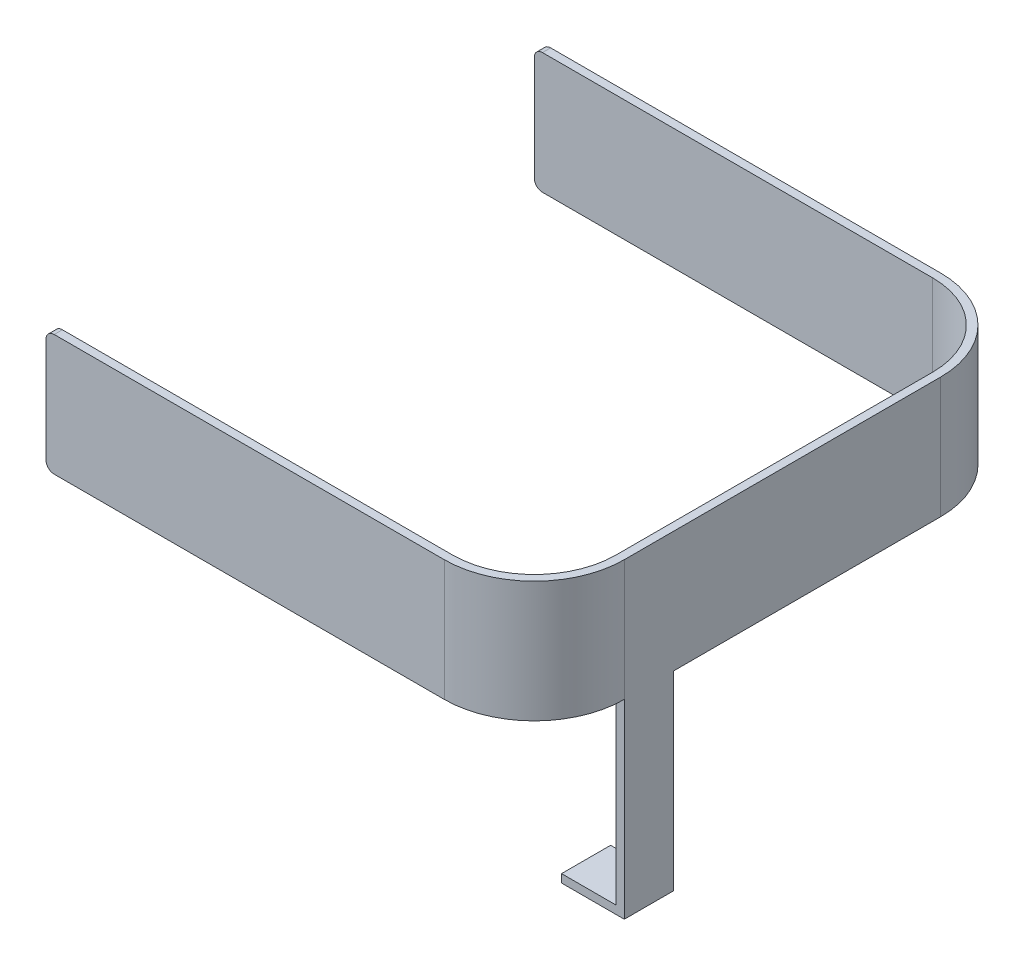
ISO-10303-21;
HEADER;
FILE_DESCRIPTION(('STEP AP214'),'2;1');
FILE_NAME('part.step','',(''),(''),'','','');
FILE_SCHEMA(('AUTOMOTIVE_DESIGN { 1 0 10303 214 1 1 1 1 }'));
ENDSEC;
DATA;
#1=APPLICATION_CONTEXT('core data for automotive mechanical design processes');
#2=APPLICATION_PROTOCOL_DEFINITION('international standard','automotive_design',2000,#1);
#3=PRODUCT_CONTEXT('',#1,'mechanical');
#4=PRODUCT('Part','Part','',(#3));
#5=PRODUCT_RELATED_PRODUCT_CATEGORY('part','',(#4));
#6=PRODUCT_DEFINITION_FORMATION('','',#4);
#7=PRODUCT_DEFINITION_CONTEXT('part definition',#1,'design');
#8=PRODUCT_DEFINITION('design','',#6,#7);
#9=PRODUCT_DEFINITION_SHAPE('','',#8);
#10=(LENGTH_UNIT() NAMED_UNIT(*) SI_UNIT(.MILLI.,.METRE.));
#11=(NAMED_UNIT(*) PLANE_ANGLE_UNIT() SI_UNIT($,.RADIAN.));
#12=(NAMED_UNIT(*) SI_UNIT($,.STERADIAN.) SOLID_ANGLE_UNIT());
#13=UNCERTAINTY_MEASURE_WITH_UNIT(LENGTH_MEASURE(1.E-05),#10,'distance_accuracy_value','');
#14=(GEOMETRIC_REPRESENTATION_CONTEXT(3) GLOBAL_UNCERTAINTY_ASSIGNED_CONTEXT((#13)) GLOBAL_UNIT_ASSIGNED_CONTEXT((#10,
#11,#12)) REPRESENTATION_CONTEXT('',''));
#15=CARTESIAN_POINT('',(0.,0.,0.));
#16=DIRECTION('',(0.,0.,1.));
#17=DIRECTION('',(1.,0.,0.));
#18=AXIS2_PLACEMENT_3D('',#15,#16,#17);
#19=CARTESIAN_POINT('',(0.3,-1.89655172413793,5.5));
#20=DIRECTION('',(0.,0.,-1.));
#21=DIRECTION('',(0.,1.,0.));
#22=AXIS2_PLACEMENT_3D('',#19,#20,#21);
#23=PLANE('',#22);
#24=DIRECTION('',(1.,0.,0.));
#25=VECTOR('',#24,1.);
#26=CARTESIAN_POINT('',(0.,-2.33291536050157,5.5));
#27=LINE('',#26,#25);
#28=CARTESIAN_POINT('',(0.,-2.33291536050157,5.5));
#29=VERTEX_POINT('',#28);
#30=CARTESIAN_POINT('',(0.3,-2.33291536050157,5.5));
#31=VERTEX_POINT('',#30);
#32=EDGE_CURVE('E331',#29,#31,#27,.T.);
#33=ORIENTED_EDGE('',*,*,#32,.F.);
#34=DIRECTION('',(0.,-1.,0.));
#35=VECTOR('',#34,1.);
#36=CARTESIAN_POINT('',(0.,-1.89655172413793,5.5));
#37=LINE('',#36,#35);
#38=CARTESIAN_POINT('',(0.,-9.01291536050157,5.5));
#39=VERTEX_POINT('',#38);
#40=EDGE_CURVE('E248',#29,#39,#37,.T.);
#41=ORIENTED_EDGE('',*,*,#40,.T.);
#42=DIRECTION('',(1.,0.,0.));
#43=VECTOR('',#42,1.);
#44=CARTESIAN_POINT('',(-2.,-9.01291536050157,5.5));
#45=LINE('',#44,#43);
#46=CARTESIAN_POINT('',(-2.,-9.01291536050157,5.5));
#47=VERTEX_POINT('',#46);
#48=EDGE_CURVE('E228',#47,#39,#45,.T.);
#49=ORIENTED_EDGE('',*,*,#48,.F.);
#50=DIRECTION('',(0.,1.,0.));
#51=VECTOR('',#50,1.);
#52=CARTESIAN_POINT('',(-2.,-9.31291536050157,5.5));
#53=LINE('',#52,#51);
#54=CARTESIAN_POINT('',(-2.,-9.31291536050157,5.5));
#55=VERTEX_POINT('',#54);
#56=EDGE_CURVE('E221',#55,#47,#53,.T.);
#57=ORIENTED_EDGE('',*,*,#56,.F.);
#58=DIRECTION('',(-1.,0.,0.));
#59=VECTOR('',#58,1.);
#60=CARTESIAN_POINT('',(0.3,-9.31291536050157,5.5));
#61=LINE('',#60,#59);
#62=CARTESIAN_POINT('',(0.3,-9.31291536050157,5.5));
#63=VERTEX_POINT('',#62);
#64=EDGE_CURVE('E262',#63,#55,#61,.T.);
#65=ORIENTED_EDGE('',*,*,#64,.F.);
#66=DIRECTION('',(0.,-1.,0.));
#67=VECTOR('',#66,1.);
#68=CARTESIAN_POINT('',(0.3,1.39655172413793,5.5));
#69=LINE('',#68,#67);
#70=EDGE_CURVE('E236',#31,#63,#69,.T.);
#71=ORIENTED_EDGE('',*,*,#70,.F.);
#72=EDGE_LOOP('',(#33,#41,#49,#57,#65,#71));
#73=FACE_BOUND('',#72,.T.);
#74=ADVANCED_FACE('F40',(#73),#23,.F.);
#75=CARTESIAN_POINT('',(0.3,2.10344827586207,5.5));
#76=DIRECTION('',(0.,-1.,0.));
#77=DIRECTION('',(0.,0.,-1.));
#78=AXIS2_PLACEMENT_3D('',#75,#76,#77);
#79=PLANE('',#78);
#80=DIRECTION('',(1.,0.,0.));
#81=VECTOR('',#80,1.);
#82=CARTESIAN_POINT('',(-17.6,2.10344827586207,8.50000000000005));
#83=LINE('',#82,#81);
#84=CARTESIAN_POINT('',(-17.3,2.10344827586207,8.50000000000005));
#85=VERTEX_POINT('',#84);
#86=CARTESIAN_POINT('',(-2.99999999999999,2.10344827586207,8.5));
#87=VERTEX_POINT('',#86);
#88=EDGE_CURVE('E323',#85,#87,#83,.T.);
#89=ORIENTED_EDGE('',*,*,#88,.F.);
#90=DIRECTION('',(0.,0.,-1.));
#91=VECTOR('',#90,1.);
#92=CARTESIAN_POINT('',(-17.3,2.10344827586207,8.80000000000005));
#93=LINE('',#92,#91);
#94=CARTESIAN_POINT('',(-17.3,2.10344827586207,8.80000000000005));
#95=VERTEX_POINT('',#94);
#96=EDGE_CURVE('E282',#85,#95,#93,.F.);
#97=ORIENTED_EDGE('',*,*,#96,.T.);
#98=DIRECTION('',(1.,0.,0.));
#99=VECTOR('',#98,1.);
#100=CARTESIAN_POINT('',(-17.6,2.10344827586207,8.80000000000005));
#101=LINE('',#100,#99);
#102=CARTESIAN_POINT('',(-2.99999999999999,2.10344827586207,8.8));
#103=VERTEX_POINT('',#102);
#104=EDGE_CURVE('E325',#95,#103,#101,.T.);
#105=ORIENTED_EDGE('',*,*,#104,.T.);
#106=CARTESIAN_POINT('',(-3.,2.10344827586207,5.5));
#107=DIRECTION('',(0.,-1.,0.));
#108=DIRECTION('',(1.,0.,0.));
#109=AXIS2_PLACEMENT_3D('',#106,#107,#108);
#110=CIRCLE('',#109,3.3);
#111=CARTESIAN_POINT('',(0.3,2.10344827586207,5.5));
#112=VERTEX_POINT('',#111);
#113=EDGE_CURVE('E201',#112,#103,#110,.T.);
#114=ORIENTED_EDGE('',*,*,#113,.F.);
#115=DIRECTION('',(0.,0.,1.));
#116=VECTOR('',#115,1.);
#117=CARTESIAN_POINT('',(0.3,2.10344827586207,5.5));
#118=LINE('',#117,#116);
#119=CARTESIAN_POINT('',(0.3,2.10344827586207,-6.1));
#120=VERTEX_POINT('',#119);
#121=EDGE_CURVE('E233',#120,#112,#118,.T.);
#122=ORIENTED_EDGE('',*,*,#121,.F.);
#123=CARTESIAN_POINT('',(-3.,2.10344827586207,-6.1));
#124=DIRECTION('',(0.,1.,0.));
#125=DIRECTION('',(1.,0.,0.));
#126=AXIS2_PLACEMENT_3D('',#123,#124,#125);
#127=CIRCLE('',#126,3.3);
#128=CARTESIAN_POINT('',(-2.99999999999999,2.10344827586207,-9.4));
#129=VERTEX_POINT('',#128);
#130=EDGE_CURVE('E207',#120,#129,#127,.T.);
#131=ORIENTED_EDGE('',*,*,#130,.T.);
#132=DIRECTION('',(1.,0.,0.));
#133=VECTOR('',#132,1.);
#134=CARTESIAN_POINT('',(-17.6,2.10344827586205,-9.40000000000006));
#135=LINE('',#134,#133);
#136=CARTESIAN_POINT('',(-17.3,2.10344827586205,-9.40000000000005));
#137=VERTEX_POINT('',#136);
#138=EDGE_CURVE('E205',#137,#129,#135,.T.);
#139=ORIENTED_EDGE('',*,*,#138,.F.);
#140=DIRECTION('',(0.,0.,-1.));
#141=VECTOR('',#140,1.);
#142=CARTESIAN_POINT('',(-17.3,2.10344827586207,-9.10000000000005));
#143=LINE('',#142,#141);
#144=CARTESIAN_POINT('',(-17.3,2.10344827586205,-9.10000000000005));
#145=VERTEX_POINT('',#144);
#146=EDGE_CURVE('E280',#137,#145,#143,.F.);
#147=ORIENTED_EDGE('',*,*,#146,.T.);
#148=DIRECTION('',(1.,0.,0.));
#149=VECTOR('',#148,1.);
#150=CARTESIAN_POINT('',(-17.6,2.10344827586205,-9.10000000000006));
#151=LINE('',#150,#149);
#152=CARTESIAN_POINT('',(-2.99999999999999,2.10344827586207,-9.1));
#153=VERTEX_POINT('',#152);
#154=EDGE_CURVE('E303',#145,#153,#151,.T.);
#155=ORIENTED_EDGE('',*,*,#154,.T.);
#156=CARTESIAN_POINT('',(-3.,2.10344827586207,-6.1));
#157=DIRECTION('',(0.,1.,0.));
#158=DIRECTION('',(1.,0.,0.));
#159=AXIS2_PLACEMENT_3D('',#156,#157,#158);
#160=CIRCLE('',#159,3.);
#161=CARTESIAN_POINT('',(0.,2.10344827586207,-6.1));
#162=VERTEX_POINT('',#161);
#163=EDGE_CURVE('E212',#162,#153,#160,.T.);
#164=ORIENTED_EDGE('',*,*,#163,.F.);
#165=DIRECTION('',(0.,0.,1.));
#166=VECTOR('',#165,1.);
#167=CARTESIAN_POINT('',(0.,2.10344827586207,5.5));
#168=LINE('',#167,#166);
#169=CARTESIAN_POINT('',(0.,2.10344827586207,5.5));
#170=VERTEX_POINT('',#169);
#171=EDGE_CURVE('E231',#162,#170,#168,.T.);
#172=ORIENTED_EDGE('',*,*,#171,.T.);
#173=CARTESIAN_POINT('',(-3.,2.10344827586207,5.5));
#174=DIRECTION('',(0.,-1.,0.));
#175=DIRECTION('',(1.,0.,0.));
#176=AXIS2_PLACEMENT_3D('',#173,#174,#175);
#177=CIRCLE('',#176,3.);
#178=EDGE_CURVE('E336',#170,#87,#177,.T.);
#179=ORIENTED_EDGE('',*,*,#178,.T.);
#180=EDGE_LOOP('',(#89,#97,#105,#114,#122,#131,#139,#147,#155,#164,#172,#179));
#181=FACE_BOUND('',#180,.T.);
#182=ADVANCED_FACE('F301',(#181),#79,.F.);
#183=CARTESIAN_POINT('',(0.3,-9.31291536050157,5.5));
#184=DIRECTION('',(0.,1.,0.));
#185=DIRECTION('',(0.,0.,1.));
#186=AXIS2_PLACEMENT_3D('',#183,#184,#185);
#187=PLANE('',#186);
#188=ORIENTED_EDGE('',*,*,#64,.T.);
#189=DIRECTION('',(0.,0.,1.));
#190=VECTOR('',#189,1.);
#191=CARTESIAN_POINT('',(-2.,-9.31291536050157,3.7));
#192=LINE('',#191,#190);
#193=CARTESIAN_POINT('',(-2.,-9.31291536050157,3.7));
#194=VERTEX_POINT('',#193);
#195=EDGE_CURVE('E218',#194,#55,#192,.T.);
#196=ORIENTED_EDGE('',*,*,#195,.F.);
#197=DIRECTION('',(-1.,0.,0.));
#198=VECTOR('',#197,1.);
#199=CARTESIAN_POINT('',(0.3,-9.31291536050157,3.7));
#200=LINE('',#199,#198);
#201=CARTESIAN_POINT('',(0.3,-9.31291536050157,3.7));
#202=VERTEX_POINT('',#201);
#203=EDGE_CURVE('E260',#202,#194,#200,.T.);
#204=ORIENTED_EDGE('',*,*,#203,.F.);
#205=DIRECTION('',(0.,0.,-1.));
#206=VECTOR('',#205,1.);
#207=CARTESIAN_POINT('',(0.3,-9.31291536050157,5.5));
#208=LINE('',#207,#206);
#209=EDGE_CURVE('E239',#63,#202,#208,.T.);
#210=ORIENTED_EDGE('',*,*,#209,.F.);
#211=EDGE_LOOP('',(#188,#196,#204,#210));
#212=FACE_BOUND('',#211,.T.);
#213=ADVANCED_FACE('F378',(#212),#187,.F.);
#214=CARTESIAN_POINT('',(0.3,-9.31291536050157,3.7));
#215=DIRECTION('',(0.,0.,1.));
#216=DIRECTION('',(0.,-1.,0.));
#217=AXIS2_PLACEMENT_3D('',#214,#215,#216);
#218=PLANE('',#217);
#219=ORIENTED_EDGE('',*,*,#203,.T.);
#220=DIRECTION('',(0.,-1.,0.));
#221=VECTOR('',#220,1.);
#222=CARTESIAN_POINT('',(-2.,-9.31291536050157,3.7));
#223=LINE('',#222,#221);
#224=CARTESIAN_POINT('',(-2.,-9.01291536050157,3.7));
#225=VERTEX_POINT('',#224);
#226=EDGE_CURVE('E210',#225,#194,#223,.T.);
#227=ORIENTED_EDGE('',*,*,#226,.F.);
#228=DIRECTION('',(1.,0.,0.));
#229=VECTOR('',#228,1.);
#230=CARTESIAN_POINT('',(-2.,-9.01291536050157,3.7));
#231=LINE('',#230,#229);
#232=CARTESIAN_POINT('',(0.,-9.01291536050157,3.7));
#233=VERTEX_POINT('',#232);
#234=EDGE_CURVE('E224',#225,#233,#231,.T.);
#235=ORIENTED_EDGE('',*,*,#234,.T.);
#236=DIRECTION('',(0.,1.,0.));
#237=VECTOR('',#236,1.);
#238=CARTESIAN_POINT('',(0.,-9.31291536050157,3.7));
#239=LINE('',#238,#237);
#240=CARTESIAN_POINT('',(0.,-2.33291536050157,3.7));
#241=VERTEX_POINT('',#240);
#242=EDGE_CURVE('E252',#233,#241,#239,.T.);
#243=ORIENTED_EDGE('',*,*,#242,.T.);
#244=DIRECTION('',(-1.,0.,0.));
#245=VECTOR('',#244,1.);
#246=CARTESIAN_POINT('',(0.3,-2.33291536050157,3.7));
#247=LINE('',#246,#245);
#248=CARTESIAN_POINT('',(0.3,-2.33291536050157,3.7));
#249=VERTEX_POINT('',#248);
#250=EDGE_CURVE('E245',#249,#241,#247,.T.);
#251=ORIENTED_EDGE('',*,*,#250,.F.);
#252=DIRECTION('',(0.,1.,0.));
#253=VECTOR('',#252,1.);
#254=CARTESIAN_POINT('',(0.3,-9.31291536050157,3.7));
#255=LINE('',#254,#253);
#256=EDGE_CURVE('E241',#202,#249,#255,.T.);
#257=ORIENTED_EDGE('',*,*,#256,.F.);
#258=EDGE_LOOP('',(#219,#227,#235,#243,#251,#257));
#259=FACE_BOUND('',#258,.T.);
#260=ADVANCED_FACE('F439',(#259),#218,.F.);
#261=CARTESIAN_POINT('',(0.3,-2.33291536050157,3.7));
#262=DIRECTION('',(0.,1.,0.));
#263=DIRECTION('',(0.,0.,1.));
#264=AXIS2_PLACEMENT_3D('',#261,#262,#263);
#265=PLANE('',#264);
#266=DIRECTION('',(1.,0.,0.));
#267=VECTOR('',#266,1.);
#268=CARTESIAN_POINT('',(-17.6,-2.33291536050158,-9.10000000000006));
#269=LINE('',#268,#267);
#270=CARTESIAN_POINT('',(-17.3,-2.33291536050158,-9.10000000000005));
#271=VERTEX_POINT('',#270);
#272=CARTESIAN_POINT('',(-2.99999999999999,-2.33291536050157,-9.1));
#273=VERTEX_POINT('',#272);
#274=EDGE_CURVE('E189',#271,#273,#269,.T.);
#275=ORIENTED_EDGE('',*,*,#274,.F.);
#276=DIRECTION('',(0.,0.,1.));
#277=VECTOR('',#276,1.);
#278=CARTESIAN_POINT('',(-17.3,-2.33291536050157,-9.40000000000005));
#279=LINE('',#278,#277);
#280=CARTESIAN_POINT('',(-17.3,-2.33291536050158,-9.40000000000005));
#281=VERTEX_POINT('',#280);
#282=EDGE_CURVE('E55',#271,#281,#279,.F.);
#283=ORIENTED_EDGE('',*,*,#282,.T.);
#284=DIRECTION('',(1.,0.,0.));
#285=VECTOR('',#284,1.);
#286=CARTESIAN_POINT('',(-17.6,-2.33291536050158,-9.40000000000006));
#287=LINE('',#286,#285);
#288=CARTESIAN_POINT('',(-2.99999999999998,-2.33291536050157,-9.4));
#289=VERTEX_POINT('',#288);
#290=EDGE_CURVE('E180',#281,#289,#287,.T.);
#291=ORIENTED_EDGE('',*,*,#290,.T.);
#292=CARTESIAN_POINT('',(-3.,-2.33291536050157,-6.1));
#293=DIRECTION('',(0.,1.,0.));
#294=DIRECTION('',(1.,0.,0.));
#295=AXIS2_PLACEMENT_3D('',#292,#293,#294);
#296=CIRCLE('',#295,3.3);
#297=CARTESIAN_POINT('',(0.3,-2.33291536050157,-6.1));
#298=VERTEX_POINT('',#297);
#299=EDGE_CURVE('E184',#298,#289,#296,.T.);
#300=ORIENTED_EDGE('',*,*,#299,.F.);
#301=DIRECTION('',(0.,0.,-1.));
#302=VECTOR('',#301,1.);
#303=CARTESIAN_POINT('',(0.3,-2.33291536050157,3.7));
#304=LINE('',#303,#302);
#305=EDGE_CURVE('E243',#249,#298,#304,.T.);
#306=ORIENTED_EDGE('',*,*,#305,.F.);
#307=ORIENTED_EDGE('',*,*,#250,.T.);
#308=DIRECTION('',(0.,0.,-1.));
#309=VECTOR('',#308,1.);
#310=CARTESIAN_POINT('',(0.,-2.33291536050157,3.7));
#311=LINE('',#310,#309);
#312=CARTESIAN_POINT('',(0.,-2.33291536050157,-6.1));
#313=VERTEX_POINT('',#312);
#314=EDGE_CURVE('E254',#241,#313,#311,.T.);
#315=ORIENTED_EDGE('',*,*,#314,.T.);
#316=CARTESIAN_POINT('',(-3.,-2.33291536050157,-6.1));
#317=DIRECTION('',(0.,1.,0.));
#318=DIRECTION('',(1.,0.,0.));
#319=AXIS2_PLACEMENT_3D('',#316,#317,#318);
#320=CIRCLE('',#319,3.);
#321=EDGE_CURVE('E200',#313,#273,#320,.T.);
#322=ORIENTED_EDGE('',*,*,#321,.T.);
#323=EDGE_LOOP('',(#275,#283,#291,#300,#306,#307,#315,#322));
#324=FACE_BOUND('',#323,.T.);
#325=ADVANCED_FACE('F182',(#324),#265,.F.);
#326=CARTESIAN_POINT('',(0.3,0.,0.));
#327=DIRECTION('',(-1.,0.,0.));
#328=DIRECTION('',(0.,0.,1.));
#329=AXIS2_PLACEMENT_3D('',#326,#327,#328);
#330=PLANE('',#329);
#331=DIRECTION('',(0.,1.,0.));
#332=VECTOR('',#331,1.);
#333=CARTESIAN_POINT('',(0.3,1.39655172413793,-6.1));
#334=LINE('',#333,#332);
#335=EDGE_CURVE('E199',#298,#120,#334,.T.);
#336=ORIENTED_EDGE('',*,*,#335,.T.);
#337=ORIENTED_EDGE('',*,*,#121,.T.);
#338=EDGE_CURVE('E237',#112,#31,#69,.T.);
#339=ORIENTED_EDGE('',*,*,#338,.T.);
#340=ORIENTED_EDGE('',*,*,#70,.T.);
#341=ORIENTED_EDGE('',*,*,#209,.T.);
#342=ORIENTED_EDGE('',*,*,#256,.T.);
#343=ORIENTED_EDGE('',*,*,#305,.T.);
#344=EDGE_LOOP('',(#336,#337,#339,#340,#341,#342,#343));
#345=FACE_BOUND('',#344,.T.);
#346=ADVANCED_FACE('F420',(#345),#330,.F.);
#347=CARTESIAN_POINT('',(0.,0.,0.));
#348=DIRECTION('',(-1.,0.,0.));
#349=DIRECTION('',(0.,0.,1.));
#350=AXIS2_PLACEMENT_3D('',#347,#348,#349);
#351=PLANE('',#350);
#352=DIRECTION('',(0.,0.,-1.));
#353=VECTOR('',#352,1.);
#354=CARTESIAN_POINT('',(0.,-9.01291536050157,3.7));
#355=LINE('',#354,#353);
#356=EDGE_CURVE('E206',#39,#233,#355,.T.);
#357=ORIENTED_EDGE('',*,*,#356,.F.);
#358=ORIENTED_EDGE('',*,*,#40,.F.);
#359=EDGE_CURVE('E249',#170,#29,#37,.T.);
#360=ORIENTED_EDGE('',*,*,#359,.F.);
#361=ORIENTED_EDGE('',*,*,#171,.F.);
#362=DIRECTION('',(0.,1.,0.));
#363=VECTOR('',#362,1.);
#364=CARTESIAN_POINT('',(0.,1.39655172413793,-6.1));
#365=LINE('',#364,#363);
#366=EDGE_CURVE('E234',#313,#162,#365,.T.);
#367=ORIENTED_EDGE('',*,*,#366,.F.);
#368=ORIENTED_EDGE('',*,*,#314,.F.);
#369=ORIENTED_EDGE('',*,*,#242,.F.);
#370=EDGE_LOOP('',(#357,#358,#360,#361,#367,#368,#369));
#371=FACE_BOUND('',#370,.T.);
#372=ADVANCED_FACE('F427',(#371),#351,.T.);
#373=CARTESIAN_POINT('',(-2.,-9.01291536050157,3.7));
#374=DIRECTION('',(0.,-1.,0.));
#375=DIRECTION('',(0.,0.,-1.));
#376=AXIS2_PLACEMENT_3D('',#373,#374,#375);
#377=PLANE('',#376);
#378=ORIENTED_EDGE('',*,*,#356,.T.);
#379=ORIENTED_EDGE('',*,*,#234,.F.);
#380=DIRECTION('',(0.,0.,-1.));
#381=VECTOR('',#380,1.);
#382=CARTESIAN_POINT('',(-2.,-9.01291536050157,3.7));
#383=LINE('',#382,#381);
#384=EDGE_CURVE('E223',#47,#225,#383,.T.);
#385=ORIENTED_EDGE('',*,*,#384,.F.);
#386=ORIENTED_EDGE('',*,*,#48,.T.);
#387=EDGE_LOOP('',(#378,#379,#385,#386));
#388=FACE_BOUND('',#387,.T.);
#389=ADVANCED_FACE('F449',(#388),#377,.F.);
#390=CARTESIAN_POINT('',(-2.,0.,0.));
#391=DIRECTION('',(1.,0.,0.));
#392=DIRECTION('',(0.,0.,-1.));
#393=AXIS2_PLACEMENT_3D('',#390,#391,#392);
#394=PLANE('',#393);
#395=ORIENTED_EDGE('',*,*,#226,.T.);
#396=ORIENTED_EDGE('',*,*,#195,.T.);
#397=ORIENTED_EDGE('',*,*,#56,.T.);
#398=ORIENTED_EDGE('',*,*,#384,.T.);
#399=EDGE_LOOP('',(#395,#396,#397,#398));
#400=FACE_BOUND('',#399,.T.);
#401=ADVANCED_FACE('F454',(#400),#394,.F.);
#402=CARTESIAN_POINT('',(-3.,2.10344827586207,-6.1));
#403=DIRECTION('',(0.,1.,0.));
#404=DIRECTION('',(0.,0.,1.));
#405=AXIS2_PLACEMENT_3D('',#402,#403,#404);
#406=CYLINDRICAL_SURFACE('',#405,3.);
#407=ORIENTED_EDGE('',*,*,#163,.T.);
#408=DIRECTION('',(0.,1.,0.));
#409=VECTOR('',#408,1.);
#410=CARTESIAN_POINT('',(-2.99999999999999,-2.33291536050157,-9.1));
#411=LINE('',#410,#409);
#412=EDGE_CURVE('E352',#273,#153,#411,.T.);
#413=ORIENTED_EDGE('',*,*,#412,.F.);
#414=ORIENTED_EDGE('',*,*,#321,.F.);
#415=ORIENTED_EDGE('',*,*,#366,.T.);
#416=EDGE_LOOP('',(#407,#413,#414,#415));
#417=FACE_BOUND('',#416,.T.);
#418=ADVANCED_FACE('F358',(#417),#406,.F.);
#419=CARTESIAN_POINT('',(-3.,2.10344827586207,-6.1));
#420=DIRECTION('',(0.,1.,0.));
#421=DIRECTION('',(0.,0.,1.));
#422=AXIS2_PLACEMENT_3D('',#419,#420,#421);
#423=CYLINDRICAL_SURFACE('',#422,3.3);
#424=DIRECTION('',(0.,-1.,0.));
#425=VECTOR('',#424,1.);
#426=CARTESIAN_POINT('',(-2.99999999999999,2.10344827586207,-9.4));
#427=LINE('',#426,#425);
#428=EDGE_CURVE('E196',#129,#289,#427,.T.);
#429=ORIENTED_EDGE('',*,*,#428,.F.);
#430=ORIENTED_EDGE('',*,*,#130,.F.);
#431=ORIENTED_EDGE('',*,*,#335,.F.);
#432=ORIENTED_EDGE('',*,*,#299,.T.);
#433=EDGE_LOOP('',(#429,#430,#431,#432));
#434=FACE_BOUND('',#433,.T.);
#435=ADVANCED_FACE('F194',(#434),#423,.T.);
#436=CARTESIAN_POINT('',(-3.,2.10344827586207,5.5));
#437=DIRECTION('',(0.,-1.,0.));
#438=DIRECTION('',(0.,0.,-1.));
#439=AXIS2_PLACEMENT_3D('',#436,#437,#438);
#440=CYLINDRICAL_SURFACE('',#439,3.);
#441=CARTESIAN_POINT('',(-3.,-2.33291536050157,5.5));
#442=DIRECTION('',(0.,-1.,0.));
#443=DIRECTION('',(1.,0.,0.));
#444=AXIS2_PLACEMENT_3D('',#441,#442,#443);
#445=CIRCLE('',#444,3.);
#446=CARTESIAN_POINT('',(-2.99999999999999,-2.33291536050157,8.5));
#447=VERTEX_POINT('',#446);
#448=EDGE_CURVE('E335',#29,#447,#445,.T.);
#449=ORIENTED_EDGE('',*,*,#448,.T.);
#450=DIRECTION('',(0.,-1.,0.));
#451=VECTOR('',#450,1.);
#452=CARTESIAN_POINT('',(-2.99999999999999,2.10344827586207,8.5));
#453=LINE('',#452,#451);
#454=EDGE_CURVE('E332',#87,#447,#453,.T.);
#455=ORIENTED_EDGE('',*,*,#454,.F.);
#456=ORIENTED_EDGE('',*,*,#178,.F.);
#457=ORIENTED_EDGE('',*,*,#359,.T.);
#458=EDGE_LOOP('',(#449,#455,#456,#457));
#459=FACE_BOUND('',#458,.T.);
#460=ADVANCED_FACE('F406',(#459),#440,.F.);
#461=CARTESIAN_POINT('',(0.,-2.33291536050157,5.5));
#462=DIRECTION('',(0.,-1.,0.));
#463=DIRECTION('',(0.,0.,-1.));
#464=AXIS2_PLACEMENT_3D('',#461,#462,#463);
#465=PLANE('',#464);
#466=DIRECTION('',(1.,0.,0.));
#467=VECTOR('',#466,1.);
#468=CARTESIAN_POINT('',(-17.6,-2.33291536050157,8.80000000000005));
#469=LINE('',#468,#467);
#470=CARTESIAN_POINT('',(-17.3,-2.33291536050157,8.80000000000005));
#471=VERTEX_POINT('',#470);
#472=CARTESIAN_POINT('',(-2.99999999999999,-2.33291536050157,8.8));
#473=VERTEX_POINT('',#472);
#474=EDGE_CURVE('E327',#471,#473,#469,.T.);
#475=ORIENTED_EDGE('',*,*,#474,.F.);
#476=DIRECTION('',(0.,0.,1.));
#477=VECTOR('',#476,1.);
#478=CARTESIAN_POINT('',(-17.3,-2.33291536050157,5.50000000000007));
#479=LINE('',#478,#477);
#480=CARTESIAN_POINT('',(-17.3,-2.33291536050157,8.50000000000005));
#481=VERTEX_POINT('',#480);
#482=EDGE_CURVE('E274',#471,#481,#479,.F.);
#483=ORIENTED_EDGE('',*,*,#482,.T.);
#484=DIRECTION('',(1.,0.,0.));
#485=VECTOR('',#484,1.);
#486=CARTESIAN_POINT('',(-17.6,-2.33291536050157,8.50000000000005));
#487=LINE('',#486,#485);
#488=EDGE_CURVE('E329',#481,#447,#487,.T.);
#489=ORIENTED_EDGE('',*,*,#488,.T.);
#490=ORIENTED_EDGE('',*,*,#448,.F.);
#491=ORIENTED_EDGE('',*,*,#32,.T.);
#492=CARTESIAN_POINT('',(-3.,-2.33291536050157,5.5));
#493=DIRECTION('',(0.,-1.,0.));
#494=DIRECTION('',(1.,0.,0.));
#495=AXIS2_PLACEMENT_3D('',#492,#493,#494);
#496=CIRCLE('',#495,3.3);
#497=EDGE_CURVE('E339',#31,#473,#496,.T.);
#498=ORIENTED_EDGE('',*,*,#497,.T.);
#499=EDGE_LOOP('',(#475,#483,#489,#490,#491,#498));
#500=FACE_BOUND('',#499,.T.);
#501=ADVANCED_FACE('F410',(#500),#465,.T.);
#502=CARTESIAN_POINT('',(-3.,2.10344827586207,5.5));
#503=DIRECTION('',(0.,-1.,0.));
#504=DIRECTION('',(0.,0.,-1.));
#505=AXIS2_PLACEMENT_3D('',#502,#503,#504);
#506=CYLINDRICAL_SURFACE('',#505,3.3);
#507=ORIENTED_EDGE('',*,*,#113,.T.);
#508=DIRECTION('',(0.,1.,0.));
#509=VECTOR('',#508,1.);
#510=CARTESIAN_POINT('',(-2.99999999999999,2.10344827586207,8.8));
#511=LINE('',#510,#509);
#512=EDGE_CURVE('E346',#473,#103,#511,.T.);
#513=ORIENTED_EDGE('',*,*,#512,.F.);
#514=ORIENTED_EDGE('',*,*,#497,.F.);
#515=ORIENTED_EDGE('',*,*,#338,.F.);
#516=EDGE_LOOP('',(#507,#513,#514,#515));
#517=FACE_BOUND('',#516,.T.);
#518=ADVANCED_FACE('F416',(#517),#506,.T.);
#519=CARTESIAN_POINT('',(-17.6,2.10344827586207,8.50000000000005));
#520=DIRECTION('',(0.,0.,1.));
#521=DIRECTION('',(1.,0.,0.));
#522=AXIS2_PLACEMENT_3D('',#519,#520,#521);
#523=PLANE('',#522);
#524=ORIENTED_EDGE('',*,*,#488,.F.);
#525=CARTESIAN_POINT('',(-17.3,-2.03291536050157,8.50000000000005));
#526=DIRECTION('',(0.,0.,1.));
#527=DIRECTION('',(1.,0.,0.));
#528=AXIS2_PLACEMENT_3D('',#525,#526,#527);
#529=CIRCLE('',#528,0.3);
#530=CARTESIAN_POINT('',(-17.6,-2.03291536050157,8.50000000000005));
#531=VERTEX_POINT('',#530);
#532=EDGE_CURVE('E278',#481,#531,#529,.F.);
#533=ORIENTED_EDGE('',*,*,#532,.T.);
#534=DIRECTION('',(0.,-1.,0.));
#535=VECTOR('',#534,1.);
#536=CARTESIAN_POINT('',(-17.6,2.10344827586207,8.50000000000005));
#537=LINE('',#536,#535);
#538=CARTESIAN_POINT('',(-17.6,1.80344827586207,8.50000000000005));
#539=VERTEX_POINT('',#538);
#540=EDGE_CURVE('E188',#539,#531,#537,.T.);
#541=ORIENTED_EDGE('',*,*,#540,.F.);
#542=CARTESIAN_POINT('',(-17.3,1.80344827586207,8.50000000000005));
#543=DIRECTION('',(0.,0.,1.));
#544=DIRECTION('',(1.,0.,0.));
#545=AXIS2_PLACEMENT_3D('',#542,#543,#544);
#546=CIRCLE('',#545,0.3);
#547=EDGE_CURVE('E276',#539,#85,#546,.F.);
#548=ORIENTED_EDGE('',*,*,#547,.T.);
#549=ORIENTED_EDGE('',*,*,#88,.T.);
#550=ORIENTED_EDGE('',*,*,#454,.T.);
#551=EDGE_LOOP('',(#524,#533,#541,#548,#549,#550));
#552=FACE_BOUND('',#551,.T.);
#553=ADVANCED_FACE('F395',(#552),#523,.F.);
#554=CARTESIAN_POINT('',(-17.6,2.10344827586207,8.80000000000005));
#555=DIRECTION('',(0.,0.,-1.));
#556=DIRECTION('',(-1.,0.,0.));
#557=AXIS2_PLACEMENT_3D('',#554,#555,#556);
#558=PLANE('',#557);
#559=DIRECTION('',(0.,1.,0.));
#560=VECTOR('',#559,1.);
#561=CARTESIAN_POINT('',(-17.6,2.10344827586207,8.80000000000005));
#562=LINE('',#561,#560);
#563=CARTESIAN_POINT('',(-17.6,-2.03291536050157,8.80000000000005));
#564=VERTEX_POINT('',#563);
#565=CARTESIAN_POINT('',(-17.6,1.80344827586207,8.80000000000005));
#566=VERTEX_POINT('',#565);
#567=EDGE_CURVE('E320',#564,#566,#562,.T.);
#568=ORIENTED_EDGE('',*,*,#567,.F.);
#569=CARTESIAN_POINT('',(-17.3,-2.03291536050157,8.80000000000005));
#570=DIRECTION('',(0.,0.,-1.));
#571=DIRECTION('',(-1.,0.,0.));
#572=AXIS2_PLACEMENT_3D('',#569,#570,#571);
#573=CIRCLE('',#572,0.3);
#574=EDGE_CURVE('E272',#564,#471,#573,.F.);
#575=ORIENTED_EDGE('',*,*,#574,.T.);
#576=ORIENTED_EDGE('',*,*,#474,.T.);
#577=ORIENTED_EDGE('',*,*,#512,.T.);
#578=ORIENTED_EDGE('',*,*,#104,.F.);
#579=CARTESIAN_POINT('',(-17.3,1.80344827586207,8.80000000000005));
#580=DIRECTION('',(0.,0.,-1.));
#581=DIRECTION('',(-1.,0.,0.));
#582=AXIS2_PLACEMENT_3D('',#579,#580,#581);
#583=CIRCLE('',#582,0.3);
#584=EDGE_CURVE('E270',#95,#566,#583,.F.);
#585=ORIENTED_EDGE('',*,*,#584,.T.);
#586=EDGE_LOOP('',(#568,#575,#576,#577,#578,#585));
#587=FACE_BOUND('',#586,.T.);
#588=ADVANCED_FACE('F414',(#587),#558,.F.);
#589=CARTESIAN_POINT('',(-17.6,0.,0.));
#590=DIRECTION('',(-1.,0.,0.));
#591=DIRECTION('',(0.,0.,1.));
#592=AXIS2_PLACEMENT_3D('',#589,#590,#591);
#593=PLANE('',#592);
#594=ORIENTED_EDGE('',*,*,#540,.T.);
#595=DIRECTION('',(0.,0.,1.));
#596=VECTOR('',#595,1.);
#597=CARTESIAN_POINT('',(-17.6,-2.03291536050157,0.));
#598=LINE('',#597,#596);
#599=EDGE_CURVE('E267',#531,#564,#598,.T.);
#600=ORIENTED_EDGE('',*,*,#599,.T.);
#601=ORIENTED_EDGE('',*,*,#567,.T.);
#602=DIRECTION('',(0.,0.,-1.));
#603=VECTOR('',#602,1.);
#604=CARTESIAN_POINT('',(-17.6,1.80344827586207,8.50000000000005));
#605=LINE('',#604,#603);
#606=EDGE_CURVE('E264',#566,#539,#605,.T.);
#607=ORIENTED_EDGE('',*,*,#606,.T.);
#608=EDGE_LOOP('',(#594,#600,#601,#607));
#609=FACE_BOUND('',#608,.T.);
#610=ADVANCED_FACE('F397',(#609),#593,.T.);
#611=CARTESIAN_POINT('',(-17.6,2.10344827586205,-9.40000000000006));
#612=DIRECTION('',(0.,0.,1.));
#613=DIRECTION('',(1.,0.,0.));
#614=AXIS2_PLACEMENT_3D('',#611,#612,#613);
#615=PLANE('',#614);
#616=ORIENTED_EDGE('',*,*,#290,.F.);
#617=CARTESIAN_POINT('',(-17.3,-2.03291536050157,-9.40000000000005));
#618=DIRECTION('',(0.,0.,1.));
#619=DIRECTION('',(1.,0.,0.));
#620=AXIS2_PLACEMENT_3D('',#617,#618,#619);
#621=CIRCLE('',#620,0.3);
#622=CARTESIAN_POINT('',(-17.6,-2.03291536050157,-9.40000000000006));
#623=VERTEX_POINT('',#622);
#624=EDGE_CURVE('E11',#281,#623,#621,.F.);
#625=ORIENTED_EDGE('',*,*,#624,.T.);
#626=DIRECTION('',(0.,-1.,0.));
#627=VECTOR('',#626,1.);
#628=CARTESIAN_POINT('',(-17.6,2.10344827586205,-9.40000000000006));
#629=LINE('',#628,#627);
#630=CARTESIAN_POINT('',(-17.6,1.80344827586207,-9.40000000000006));
#631=VERTEX_POINT('',#630);
#632=EDGE_CURVE('E295',#631,#623,#629,.T.);
#633=ORIENTED_EDGE('',*,*,#632,.F.);
#634=CARTESIAN_POINT('',(-17.3,1.80344827586207,-9.40000000000005));
#635=DIRECTION('',(0.,0.,1.));
#636=DIRECTION('',(1.,0.,0.));
#637=AXIS2_PLACEMENT_3D('',#634,#635,#636);
#638=CIRCLE('',#637,0.3);
#639=EDGE_CURVE('E48',#631,#137,#638,.F.);
#640=ORIENTED_EDGE('',*,*,#639,.T.);
#641=ORIENTED_EDGE('',*,*,#138,.T.);
#642=ORIENTED_EDGE('',*,*,#428,.T.);
#643=EDGE_LOOP('',(#616,#625,#633,#640,#641,#642));
#644=FACE_BOUND('',#643,.T.);
#645=ADVANCED_FACE('F203',(#644),#615,.F.);
#646=CARTESIAN_POINT('',(-17.6,2.10344827586205,-9.10000000000006));
#647=DIRECTION('',(0.,0.,-1.));
#648=DIRECTION('',(-1.,0.,0.));
#649=AXIS2_PLACEMENT_3D('',#646,#647,#648);
#650=PLANE('',#649);
#651=DIRECTION('',(0.,1.,0.));
#652=VECTOR('',#651,1.);
#653=CARTESIAN_POINT('',(-17.6,2.10344827586205,-9.10000000000006));
#654=LINE('',#653,#652);
#655=CARTESIAN_POINT('',(-17.6,-2.03291536050157,-9.10000000000006));
#656=VERTEX_POINT('',#655);
#657=CARTESIAN_POINT('',(-17.6,1.80344827586207,-9.10000000000006));
#658=VERTEX_POINT('',#657);
#659=EDGE_CURVE('E304',#656,#658,#654,.T.);
#660=ORIENTED_EDGE('',*,*,#659,.F.);
#661=CARTESIAN_POINT('',(-17.3,-2.03291536050157,-9.10000000000005));
#662=DIRECTION('',(0.,0.,-1.));
#663=DIRECTION('',(-1.,0.,0.));
#664=AXIS2_PLACEMENT_3D('',#661,#662,#663);
#665=CIRCLE('',#664,0.3);
#666=EDGE_CURVE('E63',#656,#271,#665,.F.);
#667=ORIENTED_EDGE('',*,*,#666,.T.);
#668=ORIENTED_EDGE('',*,*,#274,.T.);
#669=ORIENTED_EDGE('',*,*,#412,.T.);
#670=ORIENTED_EDGE('',*,*,#154,.F.);
#671=CARTESIAN_POINT('',(-17.3,1.80344827586207,-9.10000000000005));
#672=DIRECTION('',(0.,0.,-1.));
#673=DIRECTION('',(-1.,0.,0.));
#674=AXIS2_PLACEMENT_3D('',#671,#672,#673);
#675=CIRCLE('',#674,0.3);
#676=EDGE_CURVE('E290',#145,#658,#675,.F.);
#677=ORIENTED_EDGE('',*,*,#676,.T.);
#678=EDGE_LOOP('',(#660,#667,#668,#669,#670,#677));
#679=FACE_BOUND('',#678,.T.);
#680=ADVANCED_FACE('F308',(#679),#650,.F.);
#681=CARTESIAN_POINT('',(-17.6,0.,0.));
#682=DIRECTION('',(-1.,0.,0.));
#683=DIRECTION('',(0.,0.,1.));
#684=AXIS2_PLACEMENT_3D('',#681,#682,#683);
#685=PLANE('',#684);
#686=ORIENTED_EDGE('',*,*,#632,.T.);
#687=DIRECTION('',(0.,0.,1.));
#688=VECTOR('',#687,1.);
#689=CARTESIAN_POINT('',(-17.6,-2.03291536050157,-9.10000000000006));
#690=LINE('',#689,#688);
#691=EDGE_CURVE('E287',#623,#656,#690,.T.);
#692=ORIENTED_EDGE('',*,*,#691,.T.);
#693=ORIENTED_EDGE('',*,*,#659,.T.);
#694=DIRECTION('',(0.,0.,-1.));
#695=VECTOR('',#694,1.);
#696=CARTESIAN_POINT('',(-17.6,1.80344827586207,-9.40000000000006));
#697=LINE('',#696,#695);
#698=EDGE_CURVE('E284',#658,#631,#697,.T.);
#699=ORIENTED_EDGE('',*,*,#698,.T.);
#700=EDGE_LOOP('',(#686,#692,#693,#699));
#701=FACE_BOUND('',#700,.T.);
#702=ADVANCED_FACE('F311',(#701),#685,.T.);
#703=CARTESIAN_POINT('',(-17.3,-2.03291536050157,0.));
#704=DIRECTION('',(0.,0.,1.));
#705=DIRECTION('',(1.,0.,0.));
#706=AXIS2_PLACEMENT_3D('',#703,#704,#705);
#707=CYLINDRICAL_SURFACE('',#706,0.3);
#708=ORIENTED_EDGE('',*,*,#532,.F.);
#709=ORIENTED_EDGE('',*,*,#482,.F.);
#710=ORIENTED_EDGE('',*,*,#574,.F.);
#711=ORIENTED_EDGE('',*,*,#599,.F.);
#712=EDGE_LOOP('',(#708,#709,#710,#711));
#713=FACE_BOUND('',#712,.T.);
#714=ADVANCED_FACE('F369',(#713),#707,.T.);
#715=CARTESIAN_POINT('',(-17.3,1.80344827586207,0.));
#716=DIRECTION('',(0.,0.,1.));
#717=DIRECTION('',(1.,0.,0.));
#718=AXIS2_PLACEMENT_3D('',#715,#716,#717);
#719=CYLINDRICAL_SURFACE('',#718,0.3);
#720=ORIENTED_EDGE('',*,*,#584,.F.);
#721=ORIENTED_EDGE('',*,*,#96,.F.);
#722=ORIENTED_EDGE('',*,*,#547,.F.);
#723=ORIENTED_EDGE('',*,*,#606,.F.);
#724=EDGE_LOOP('',(#720,#721,#722,#723));
#725=FACE_BOUND('',#724,.T.);
#726=ADVANCED_FACE('F364',(#725),#719,.T.);
#727=CARTESIAN_POINT('',(-17.3,-2.03291536050157,0.));
#728=DIRECTION('',(0.,0.,-1.));
#729=DIRECTION('',(-1.,0.,0.));
#730=AXIS2_PLACEMENT_3D('',#727,#728,#729);
#731=CYLINDRICAL_SURFACE('',#730,0.3);
#732=ORIENTED_EDGE('',*,*,#624,.F.);
#733=ORIENTED_EDGE('',*,*,#282,.F.);
#734=ORIENTED_EDGE('',*,*,#666,.F.);
#735=ORIENTED_EDGE('',*,*,#691,.F.);
#736=EDGE_LOOP('',(#732,#733,#734,#735));
#737=FACE_BOUND('',#736,.T.);
#738=ADVANCED_FACE('F362',(#737),#731,.T.);
#739=CARTESIAN_POINT('',(-17.3,1.80344827586207,0.));
#740=DIRECTION('',(0.,0.,1.));
#741=DIRECTION('',(1.,0.,0.));
#742=AXIS2_PLACEMENT_3D('',#739,#740,#741);
#743=CYLINDRICAL_SURFACE('',#742,0.3);
#744=ORIENTED_EDGE('',*,*,#676,.F.);
#745=ORIENTED_EDGE('',*,*,#146,.F.);
#746=ORIENTED_EDGE('',*,*,#639,.F.);
#747=ORIENTED_EDGE('',*,*,#698,.F.);
#748=EDGE_LOOP('',(#744,#745,#746,#747));
#749=FACE_BOUND('',#748,.T.);
#750=ADVANCED_FACE('F42',(#749),#743,.T.);
#751=CLOSED_SHELL('',(#74,#182,#213,#260,#325,#346,#372,#389,#401,#418,#435,#460,#501,#518,#553,
#588,#610,#645,#680,#702,#714,#726,#738,#750));
#752=MANIFOLD_SOLID_BREP('B2',#751);
#753=ADVANCED_BREP_SHAPE_REPRESENTATION('',(#18,#752),#14);
#754=SHAPE_DEFINITION_REPRESENTATION(#9,#753);
ENDSEC;
END-ISO-10303-21;
